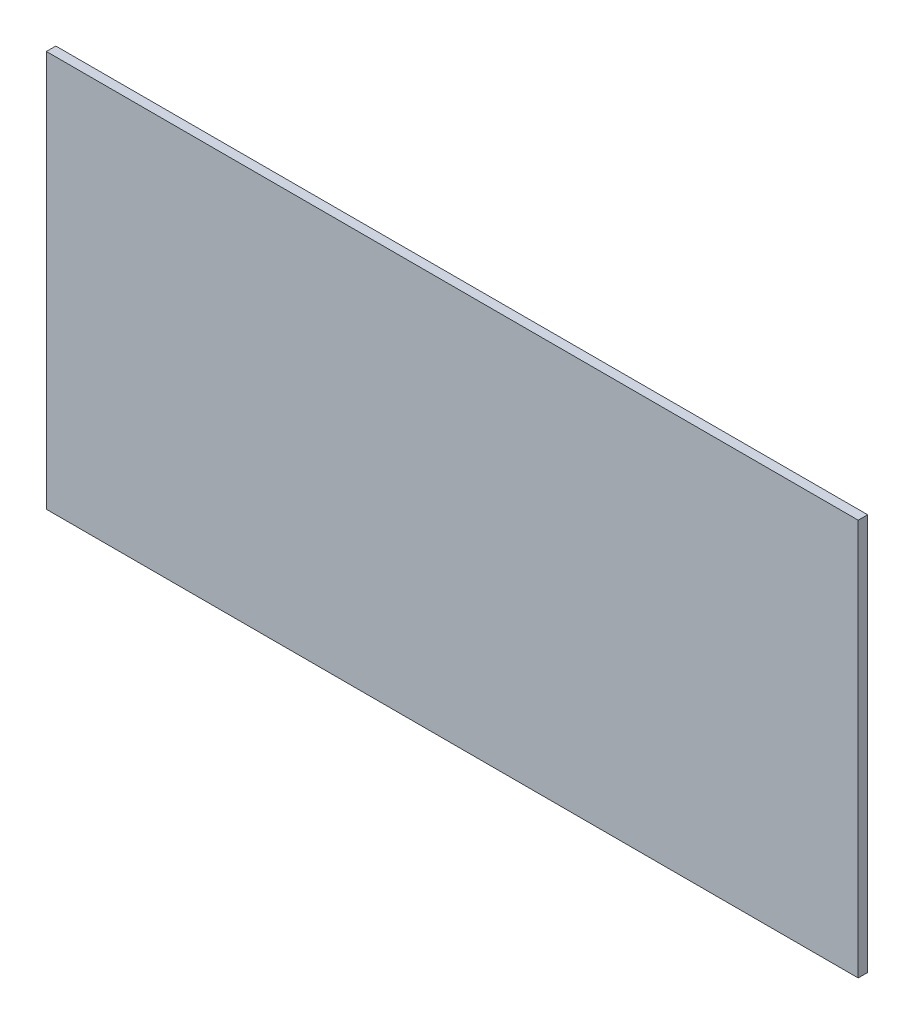
ISO-10303-21;
HEADER;
FILE_DESCRIPTION(('STEP AP214'),'2;1');
FILE_NAME('part.step','',(''),(''),'','','');
FILE_SCHEMA(('AUTOMOTIVE_DESIGN { 1 0 10303 214 1 1 1 1 }'));
ENDSEC;
DATA;
#1=APPLICATION_CONTEXT('core data for automotive mechanical design processes');
#2=APPLICATION_PROTOCOL_DEFINITION('international standard','automotive_design',2000,#1);
#3=PRODUCT_CONTEXT('',#1,'mechanical');
#4=PRODUCT('Part','Part','',(#3));
#5=PRODUCT_RELATED_PRODUCT_CATEGORY('part','',(#4));
#6=PRODUCT_DEFINITION_FORMATION('','',#4);
#7=PRODUCT_DEFINITION_CONTEXT('part definition',#1,'design');
#8=PRODUCT_DEFINITION('design','',#6,#7);
#9=PRODUCT_DEFINITION_SHAPE('','',#8);
#10=(LENGTH_UNIT() NAMED_UNIT(*) SI_UNIT(.MILLI.,.METRE.));
#11=(NAMED_UNIT(*) PLANE_ANGLE_UNIT() SI_UNIT($,.RADIAN.));
#12=(NAMED_UNIT(*) SI_UNIT($,.STERADIAN.) SOLID_ANGLE_UNIT());
#13=UNCERTAINTY_MEASURE_WITH_UNIT(LENGTH_MEASURE(1.E-05),#10,'distance_accuracy_value','');
#14=(GEOMETRIC_REPRESENTATION_CONTEXT(3) GLOBAL_UNCERTAINTY_ASSIGNED_CONTEXT((#13)) GLOBAL_UNIT_ASSIGNED_CONTEXT((#10,
#11,#12)) REPRESENTATION_CONTEXT('',''));
#15=CARTESIAN_POINT('',(0.,0.,0.));
#16=DIRECTION('',(0.,0.,1.));
#17=DIRECTION('',(1.,0.,0.));
#18=AXIS2_PLACEMENT_3D('',#15,#16,#17);
#19=CARTESIAN_POINT('',(0.,0.,1.));
#20=DIRECTION('',(1.,0.,0.));
#21=DIRECTION('',(0.,0.,-1.));
#22=AXIS2_PLACEMENT_3D('',#19,#20,#21);
#23=PLANE('',#22);
#24=DIRECTION('',(0.,-1.,0.));
#25=VECTOR('',#24,1.);
#26=CARTESIAN_POINT('',(0.,0.,0.));
#27=LINE('',#26,#25);
#28=CARTESIAN_POINT('',(0.,42.,0.));
#29=VERTEX_POINT('',#28);
#30=CARTESIAN_POINT('',(0.,0.,0.));
#31=VERTEX_POINT('',#30);
#32=EDGE_CURVE('E108',#29,#31,#27,.T.);
#33=ORIENTED_EDGE('',*,*,#32,.T.);
#34=DIRECTION('',(0.,0.,-1.));
#35=VECTOR('',#34,1.);
#36=CARTESIAN_POINT('',(0.,0.,1.));
#37=LINE('',#36,#35);
#38=CARTESIAN_POINT('',(0.,0.,1.));
#39=VERTEX_POINT('',#38);
#40=EDGE_CURVE('E11',#39,#31,#37,.T.);
#41=ORIENTED_EDGE('',*,*,#40,.F.);
#42=DIRECTION('',(0.,-1.,0.));
#43=VECTOR('',#42,1.);
#44=CARTESIAN_POINT('',(0.,0.,1.));
#45=LINE('',#44,#43);
#46=CARTESIAN_POINT('',(0.,42.,1.));
#47=VERTEX_POINT('',#46);
#48=EDGE_CURVE('E92',#47,#39,#45,.T.);
#49=ORIENTED_EDGE('',*,*,#48,.F.);
#50=DIRECTION('',(0.,0.,-1.));
#51=VECTOR('',#50,1.);
#52=CARTESIAN_POINT('',(0.,42.,1.));
#53=LINE('',#52,#51);
#54=EDGE_CURVE('E105',#47,#29,#53,.T.);
#55=ORIENTED_EDGE('',*,*,#54,.T.);
#56=EDGE_LOOP('',(#33,#41,#49,#55));
#57=FACE_BOUND('',#56,.T.);
#58=ADVANCED_FACE('F43',(#57),#23,.F.);
#59=CARTESIAN_POINT('',(0.,0.,1.));
#60=DIRECTION('',(0.,1.,0.));
#61=DIRECTION('',(0.,0.,1.));
#62=AXIS2_PLACEMENT_3D('',#59,#60,#61);
#63=PLANE('',#62);
#64=DIRECTION('',(1.,0.,0.));
#65=VECTOR('',#64,1.);
#66=CARTESIAN_POINT('',(0.,0.,0.));
#67=LINE('',#66,#65);
#68=CARTESIAN_POINT('',(86.,0.,0.));
#69=VERTEX_POINT('',#68);
#70=EDGE_CURVE('E97',#31,#69,#67,.T.);
#71=ORIENTED_EDGE('',*,*,#70,.T.);
#72=DIRECTION('',(0.,0.,-1.));
#73=VECTOR('',#72,1.);
#74=CARTESIAN_POINT('',(86.,0.,1.));
#75=LINE('',#74,#73);
#76=CARTESIAN_POINT('',(86.,0.,1.));
#77=VERTEX_POINT('',#76);
#78=EDGE_CURVE('E51',#77,#69,#75,.T.);
#79=ORIENTED_EDGE('',*,*,#78,.F.);
#80=DIRECTION('',(1.,0.,0.));
#81=VECTOR('',#80,1.);
#82=CARTESIAN_POINT('',(0.,0.,1.));
#83=LINE('',#82,#81);
#84=EDGE_CURVE('E87',#39,#77,#83,.T.);
#85=ORIENTED_EDGE('',*,*,#84,.F.);
#86=ORIENTED_EDGE('',*,*,#40,.T.);
#87=EDGE_LOOP('',(#71,#79,#85,#86));
#88=FACE_BOUND('',#87,.T.);
#89=ADVANCED_FACE('F100',(#88),#63,.F.);
#90=CARTESIAN_POINT('',(86.,0.,1.));
#91=DIRECTION('',(-1.,0.,0.));
#92=DIRECTION('',(0.,0.,1.));
#93=AXIS2_PLACEMENT_3D('',#90,#91,#92);
#94=PLANE('',#93);
#95=DIRECTION('',(0.,1.,0.));
#96=VECTOR('',#95,1.);
#97=CARTESIAN_POINT('',(86.,0.,0.));
#98=LINE('',#97,#96);
#99=CARTESIAN_POINT('',(86.,42.,0.));
#100=VERTEX_POINT('',#99);
#101=EDGE_CURVE('E78',#69,#100,#98,.T.);
#102=ORIENTED_EDGE('',*,*,#101,.T.);
#103=DIRECTION('',(0.,0.,-1.));
#104=VECTOR('',#103,1.);
#105=CARTESIAN_POINT('',(86.,42.,1.));
#106=LINE('',#105,#104);
#107=CARTESIAN_POINT('',(86.,42.,1.));
#108=VERTEX_POINT('',#107);
#109=EDGE_CURVE('E98',#108,#100,#106,.T.);
#110=ORIENTED_EDGE('',*,*,#109,.F.);
#111=DIRECTION('',(0.,1.,0.));
#112=VECTOR('',#111,1.);
#113=CARTESIAN_POINT('',(86.,0.,1.));
#114=LINE('',#113,#112);
#115=EDGE_CURVE('E95',#77,#108,#114,.T.);
#116=ORIENTED_EDGE('',*,*,#115,.F.);
#117=ORIENTED_EDGE('',*,*,#78,.T.);
#118=EDGE_LOOP('',(#102,#110,#116,#117));
#119=FACE_BOUND('',#118,.T.);
#120=ADVANCED_FACE('F99',(#119),#94,.F.);
#121=CARTESIAN_POINT('',(0.,42.,1.));
#122=DIRECTION('',(0.,-1.,0.));
#123=DIRECTION('',(0.,0.,-1.));
#124=AXIS2_PLACEMENT_3D('',#121,#122,#123);
#125=PLANE('',#124);
#126=DIRECTION('',(-1.,0.,0.));
#127=VECTOR('',#126,1.);
#128=CARTESIAN_POINT('',(0.,42.,0.));
#129=LINE('',#128,#127);
#130=EDGE_CURVE('E85',#100,#29,#129,.T.);
#131=ORIENTED_EDGE('',*,*,#130,.T.);
#132=ORIENTED_EDGE('',*,*,#54,.F.);
#133=DIRECTION('',(-1.,0.,0.));
#134=VECTOR('',#133,1.);
#135=CARTESIAN_POINT('',(0.,42.,1.));
#136=LINE('',#135,#134);
#137=EDGE_CURVE('E56',#108,#47,#136,.T.);
#138=ORIENTED_EDGE('',*,*,#137,.F.);
#139=ORIENTED_EDGE('',*,*,#109,.T.);
#140=EDGE_LOOP('',(#131,#132,#138,#139));
#141=FACE_BOUND('',#140,.T.);
#142=ADVANCED_FACE('F111',(#141),#125,.F.);
#143=CARTESIAN_POINT('',(0.,0.,1.));
#144=DIRECTION('',(0.,0.,-1.));
#145=DIRECTION('',(-1.,0.,0.));
#146=AXIS2_PLACEMENT_3D('',#143,#144,#145);
#147=PLANE('',#146);
#148=ORIENTED_EDGE('',*,*,#48,.T.);
#149=ORIENTED_EDGE('',*,*,#84,.T.);
#150=ORIENTED_EDGE('',*,*,#115,.T.);
#151=ORIENTED_EDGE('',*,*,#137,.T.);
#152=EDGE_LOOP('',(#148,#149,#150,#151));
#153=FACE_BOUND('',#152,.T.);
#154=ADVANCED_FACE('F89',(#153),#147,.F.);
#155=CARTESIAN_POINT('',(0.,0.,0.));
#156=DIRECTION('',(0.,0.,-1.));
#157=DIRECTION('',(-1.,0.,0.));
#158=AXIS2_PLACEMENT_3D('',#155,#156,#157);
#159=PLANE('',#158);
#160=ORIENTED_EDGE('',*,*,#32,.F.);
#161=ORIENTED_EDGE('',*,*,#130,.F.);
#162=ORIENTED_EDGE('',*,*,#101,.F.);
#163=ORIENTED_EDGE('',*,*,#70,.F.);
#164=EDGE_LOOP('',(#160,#161,#162,#163));
#165=FACE_BOUND('',#164,.T.);
#166=ADVANCED_FACE('F116',(#165),#159,.T.);
#167=CLOSED_SHELL('',(#58,#89,#120,#142,#154,#166));
#168=MANIFOLD_SOLID_BREP('B2',#167);
#169=ADVANCED_BREP_SHAPE_REPRESENTATION('',(#18,#168),#14);
#170=SHAPE_DEFINITION_REPRESENTATION(#9,#169);
ENDSEC;
END-ISO-10303-21;
